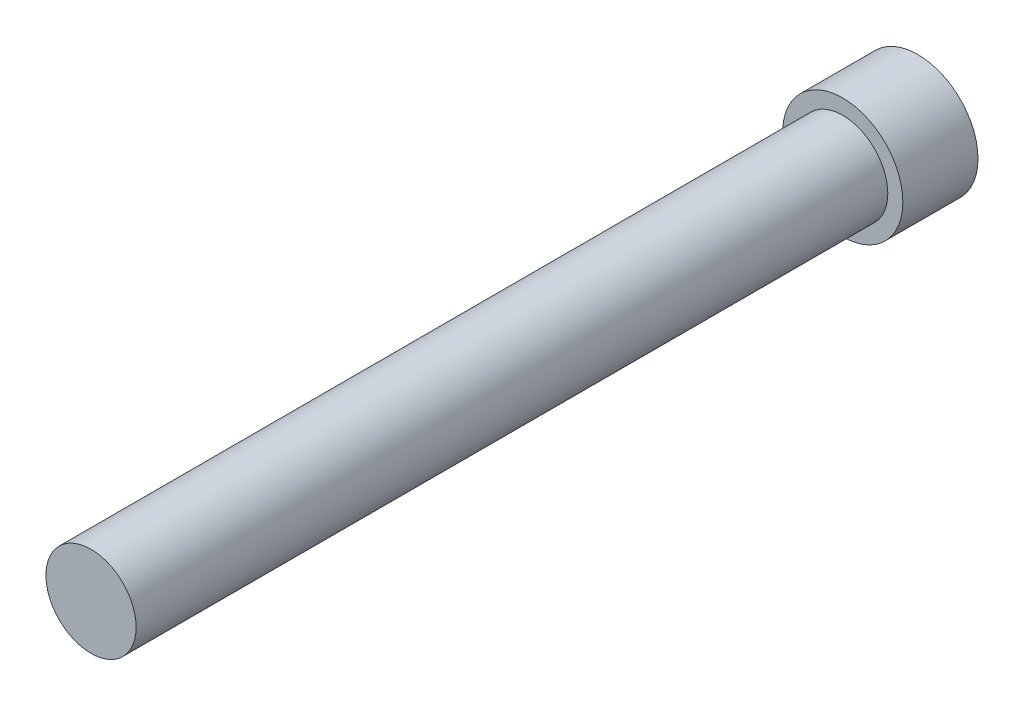
ISO-10303-21;
HEADER;
FILE_DESCRIPTION(('STEP AP214'),'2;1');
FILE_NAME('part.step','',(''),(''),'','','');
FILE_SCHEMA(('AUTOMOTIVE_DESIGN { 1 0 10303 214 1 1 1 1 }'));
ENDSEC;
DATA;
#1=APPLICATION_CONTEXT('core data for automotive mechanical design processes');
#2=APPLICATION_PROTOCOL_DEFINITION('international standard','automotive_design',2000,#1);
#3=PRODUCT_CONTEXT('',#1,'mechanical');
#4=PRODUCT('Part','Part','',(#3));
#5=PRODUCT_RELATED_PRODUCT_CATEGORY('part','',(#4));
#6=PRODUCT_DEFINITION_FORMATION('','',#4);
#7=PRODUCT_DEFINITION_CONTEXT('part definition',#1,'design');
#8=PRODUCT_DEFINITION('design','',#6,#7);
#9=PRODUCT_DEFINITION_SHAPE('','',#8);
#10=(LENGTH_UNIT() NAMED_UNIT(*) SI_UNIT(.MILLI.,.METRE.));
#11=(NAMED_UNIT(*) PLANE_ANGLE_UNIT() SI_UNIT($,.RADIAN.));
#12=(NAMED_UNIT(*) SI_UNIT($,.STERADIAN.) SOLID_ANGLE_UNIT());
#13=UNCERTAINTY_MEASURE_WITH_UNIT(LENGTH_MEASURE(1.E-05),#10,'distance_accuracy_value','');
#14=(GEOMETRIC_REPRESENTATION_CONTEXT(3) GLOBAL_UNCERTAINTY_ASSIGNED_CONTEXT((#13)) GLOBAL_UNIT_ASSIGNED_CONTEXT((#10,
#11,#12)) REPRESENTATION_CONTEXT('',''));
#15=CARTESIAN_POINT('',(0.,0.,0.));
#16=DIRECTION('',(0.,0.,1.));
#17=DIRECTION('',(1.,0.,0.));
#18=AXIS2_PLACEMENT_3D('',#15,#16,#17);
#19=CARTESIAN_POINT('',(0.,0.,2.5));
#20=DIRECTION('',(0.,0.,1.));
#21=DIRECTION('',(1.,0.,0.));
#22=AXIS2_PLACEMENT_3D('',#19,#20,#21);
#23=PLANE('',#22);
#24=CARTESIAN_POINT('',(0.,0.,2.5));
#25=DIRECTION('',(0.,0.,1.));
#26=DIRECTION('',(1.,0.,0.));
#27=AXIS2_PLACEMENT_3D('',#24,#25,#26);
#28=CIRCLE('',#27,1.5);
#29=CARTESIAN_POINT('',(1.5,0.,2.5));
#30=VERTEX_POINT('',#29);
#31=EDGE_CURVE('E173',#30,#30,#28,.T.);
#32=ORIENTED_EDGE('',*,*,#31,.F.);
#33=EDGE_LOOP('',(#32));
#34=FACE_BOUND('',#33,.T.);
#35=CARTESIAN_POINT('',(0.,0.,2.5));
#36=DIRECTION('',(0.,0.,1.));
#37=DIRECTION('',(1.,0.,0.));
#38=AXIS2_PLACEMENT_3D('',#35,#36,#37);
#39=CIRCLE('',#38,2.);
#40=CARTESIAN_POINT('',(2.,0.,2.5));
#41=VERTEX_POINT('',#40);
#42=EDGE_CURVE('E11',#41,#41,#39,.T.);
#43=ORIENTED_EDGE('',*,*,#42,.T.);
#44=EDGE_LOOP('',(#43));
#45=FACE_BOUND('',#44,.T.);
#46=ADVANCED_FACE('F37',(#34,#45),#23,.T.);
#47=CARTESIAN_POINT('',(0.,0.,0.));
#48=DIRECTION('',(0.,0.,1.));
#49=DIRECTION('',(1.,0.,0.));
#50=AXIS2_PLACEMENT_3D('',#47,#48,#49);
#51=PLANE('',#50);
#52=CARTESIAN_POINT('',(0.,0.,0.));
#53=DIRECTION('',(0.,0.,1.));
#54=DIRECTION('',(1.,0.,0.));
#55=AXIS2_PLACEMENT_3D('',#52,#53,#54);
#56=CIRCLE('',#55,2.);
#57=CARTESIAN_POINT('',(2.,0.,0.));
#58=VERTEX_POINT('',#57);
#59=EDGE_CURVE('E41',#58,#58,#56,.T.);
#60=ORIENTED_EDGE('',*,*,#59,.F.);
#61=EDGE_LOOP('',(#60));
#62=FACE_BOUND('',#61,.T.);
#63=DIRECTION('',(-0.979936991565401,-0.199307532626719,0.));
#64=VECTOR('',#63,1.);
#65=CARTESIAN_POINT('',(0.458074191553048,1.3687590614737,0.));
#66=LINE('',#65,#64);
#67=CARTESIAN_POINT('',(0.458074191553048,1.3687590614737,0.));
#68=VERTEX_POINT('',#67);
#69=CARTESIAN_POINT('',(-0.956343023119844,1.08108341743981,0.));
#70=VERTEX_POINT('',#69);
#71=EDGE_CURVE('E52',#68,#70,#66,.T.);
#72=ORIENTED_EDGE('',*,*,#71,.T.);
#73=DIRECTION('',(-0.317363109362366,-0.948304095117094,0.));
#74=VECTOR('',#73,1.);
#75=CARTESIAN_POINT('',(-0.956343023119844,1.08108341743981,0.));
#76=LINE('',#75,#74);
#77=CARTESIAN_POINT('',(-1.41441721467289,-0.28767564403389,0.));
#78=VERTEX_POINT('',#77);
#79=EDGE_CURVE('E112',#70,#78,#76,.T.);
#80=ORIENTED_EDGE('',*,*,#79,.T.);
#81=DIRECTION('',(0.662573882203035,-0.748996562490375,0.));
#82=VECTOR('',#81,1.);
#83=CARTESIAN_POINT('',(-1.41441721467289,-0.28767564403389,0.));
#84=LINE('',#83,#82);
#85=CARTESIAN_POINT('',(-0.458074191553046,-1.3687590614737,0.));
#86=VERTEX_POINT('',#85);
#87=EDGE_CURVE('E110',#78,#86,#84,.T.);
#88=ORIENTED_EDGE('',*,*,#87,.T.);
#89=DIRECTION('',(0.979936991565401,0.199307532626719,0.));
#90=VECTOR('',#89,1.);
#91=CARTESIAN_POINT('',(-0.458074191553046,-1.3687590614737,0.));
#92=LINE('',#91,#90);
#93=CARTESIAN_POINT('',(0.956343023119844,-1.08108341743981,0.));
#94=VERTEX_POINT('',#93);
#95=EDGE_CURVE('E88',#86,#94,#92,.T.);
#96=ORIENTED_EDGE('',*,*,#95,.T.);
#97=DIRECTION('',(0.317363109362366,0.948304095117094,0.));
#98=VECTOR('',#97,1.);
#99=CARTESIAN_POINT('',(0.956343023119844,-1.08108341743981,0.));
#100=LINE('',#99,#98);
#101=CARTESIAN_POINT('',(1.41441721467289,0.28767564403389,0.));
#102=VERTEX_POINT('',#101);
#103=EDGE_CURVE('E99',#94,#102,#100,.T.);
#104=ORIENTED_EDGE('',*,*,#103,.T.);
#105=DIRECTION('',(-0.662573882203035,0.748996562490376,0.));
#106=VECTOR('',#105,1.);
#107=CARTESIAN_POINT('',(1.41441721467289,0.28767564403389,0.));
#108=LINE('',#107,#106);
#109=EDGE_CURVE('E105',#102,#68,#108,.T.);
#110=ORIENTED_EDGE('',*,*,#109,.T.);
#111=EDGE_LOOP('',(#72,#80,#88,#96,#104,#110));
#112=FACE_BOUND('',#111,.T.);
#113=ADVANCED_FACE('F107',(#62,#112),#51,.F.);
#114=CARTESIAN_POINT('',(0.,0.,2.5));
#115=DIRECTION('',(0.,0.,-1.));
#116=DIRECTION('',(-1.,0.,0.));
#117=AXIS2_PLACEMENT_3D('',#114,#115,#116);
#118=CYLINDRICAL_SURFACE('',#117,2.);
#119=ORIENTED_EDGE('',*,*,#42,.F.);
#120=EDGE_LOOP('',(#119));
#121=FACE_BOUND('',#120,.T.);
#122=ORIENTED_EDGE('',*,*,#59,.T.);
#123=EDGE_LOOP('',(#122));
#124=FACE_BOUND('',#123,.T.);
#125=ADVANCED_FACE('F39',(#121,#124),#118,.T.);
#126=CARTESIAN_POINT('',(0.458074191553048,1.3687590614737,2.5));
#127=DIRECTION('',(0.199307532626719,-0.979936991565401,0.));
#128=DIRECTION('',(0.979936991565401,0.199307532626719,0.));
#129=AXIS2_PLACEMENT_3D('',#126,#127,#128);
#130=PLANE('',#129);
#131=ORIENTED_EDGE('',*,*,#71,.F.);
#132=DIRECTION('',(0.,0.,-1.));
#133=VECTOR('',#132,1.);
#134=CARTESIAN_POINT('',(0.458074191553048,1.3687590614737,2.5));
#135=LINE('',#134,#133);
#136=CARTESIAN_POINT('',(0.458074191553048,1.3687590614737,2.5));
#137=VERTEX_POINT('',#136);
#138=EDGE_CURVE('E117',#137,#68,#135,.T.);
#139=ORIENTED_EDGE('',*,*,#138,.F.);
#140=DIRECTION('',(-0.979936991565401,-0.199307532626719,0.));
#141=VECTOR('',#140,1.);
#142=CARTESIAN_POINT('',(0.458074191553048,1.3687590614737,2.5));
#143=LINE('',#142,#141);
#144=CARTESIAN_POINT('',(-0.956343023119844,1.08108341743981,2.5));
#145=VERTEX_POINT('',#144);
#146=EDGE_CURVE('E61',#137,#145,#143,.T.);
#147=ORIENTED_EDGE('',*,*,#146,.T.);
#148=DIRECTION('',(0.,0.,-1.));
#149=VECTOR('',#148,1.);
#150=CARTESIAN_POINT('',(-0.956343023119844,1.08108341743981,2.5));
#151=LINE('',#150,#149);
#152=EDGE_CURVE('E124',#145,#70,#151,.T.);
#153=ORIENTED_EDGE('',*,*,#152,.T.);
#154=EDGE_LOOP('',(#131,#139,#147,#153));
#155=FACE_BOUND('',#154,.T.);
#156=ADVANCED_FACE('F135',(#155),#130,.T.);
#157=CARTESIAN_POINT('',(-0.956343023119844,1.08108341743981,2.5));
#158=DIRECTION('',(0.948304095117094,-0.317363109362366,0.));
#159=DIRECTION('',(0.317363109362366,0.948304095117094,0.));
#160=AXIS2_PLACEMENT_3D('',#157,#158,#159);
#161=PLANE('',#160);
#162=ORIENTED_EDGE('',*,*,#79,.F.);
#163=ORIENTED_EDGE('',*,*,#152,.F.);
#164=DIRECTION('',(-0.317363109362366,-0.948304095117094,0.));
#165=VECTOR('',#164,1.);
#166=CARTESIAN_POINT('',(-0.956343023119844,1.08108341743981,2.5));
#167=LINE('',#166,#165);
#168=CARTESIAN_POINT('',(-1.41441721467289,-0.28767564403389,2.5));
#169=VERTEX_POINT('',#168);
#170=EDGE_CURVE('E180',#145,#169,#167,.T.);
#171=ORIENTED_EDGE('',*,*,#170,.T.);
#172=DIRECTION('',(0.,0.,-1.));
#173=VECTOR('',#172,1.);
#174=CARTESIAN_POINT('',(-1.41441721467289,-0.28767564403389,2.5));
#175=LINE('',#174,#173);
#176=EDGE_CURVE('E122',#169,#78,#175,.T.);
#177=ORIENTED_EDGE('',*,*,#176,.T.);
#178=EDGE_LOOP('',(#162,#163,#171,#177));
#179=FACE_BOUND('',#178,.T.);
#180=ADVANCED_FACE('F142',(#179),#161,.T.);
#181=CARTESIAN_POINT('',(-1.41441721467289,-0.28767564403389,2.5));
#182=DIRECTION('',(0.748996562490375,0.662573882203035,0.));
#183=DIRECTION('',(-0.662573882203035,0.748996562490375,0.));
#184=AXIS2_PLACEMENT_3D('',#181,#182,#183);
#185=PLANE('',#184);
#186=ORIENTED_EDGE('',*,*,#87,.F.);
#187=ORIENTED_EDGE('',*,*,#176,.F.);
#188=DIRECTION('',(0.662573882203035,-0.748996562490375,0.));
#189=VECTOR('',#188,1.);
#190=CARTESIAN_POINT('',(-1.41441721467289,-0.28767564403389,2.5));
#191=LINE('',#190,#189);
#192=CARTESIAN_POINT('',(-0.458074191553046,-1.3687590614737,2.5));
#193=VERTEX_POINT('',#192);
#194=EDGE_CURVE('E183',#169,#193,#191,.T.);
#195=ORIENTED_EDGE('',*,*,#194,.T.);
#196=DIRECTION('',(0.,0.,-1.));
#197=VECTOR('',#196,1.);
#198=CARTESIAN_POINT('',(-0.458074191553046,-1.3687590614737,2.5));
#199=LINE('',#198,#197);
#200=EDGE_CURVE('E95',#193,#86,#199,.T.);
#201=ORIENTED_EDGE('',*,*,#200,.T.);
#202=EDGE_LOOP('',(#186,#187,#195,#201));
#203=FACE_BOUND('',#202,.T.);
#204=ADVANCED_FACE('F145',(#203),#185,.T.);
#205=CARTESIAN_POINT('',(-0.458074191553046,-1.3687590614737,2.5));
#206=DIRECTION('',(-0.199307532626719,0.979936991565401,0.));
#207=DIRECTION('',(-0.979936991565401,-0.199307532626719,0.));
#208=AXIS2_PLACEMENT_3D('',#205,#206,#207);
#209=PLANE('',#208);
#210=ORIENTED_EDGE('',*,*,#95,.F.);
#211=ORIENTED_EDGE('',*,*,#200,.F.);
#212=DIRECTION('',(0.979936991565401,0.199307532626719,0.));
#213=VECTOR('',#212,1.);
#214=CARTESIAN_POINT('',(-0.458074191553046,-1.3687590614737,2.5));
#215=LINE('',#214,#213);
#216=CARTESIAN_POINT('',(0.956343023119844,-1.08108341743981,2.5));
#217=VERTEX_POINT('',#216);
#218=EDGE_CURVE('E92',#193,#217,#215,.T.);
#219=ORIENTED_EDGE('',*,*,#218,.T.);
#220=DIRECTION('',(0.,0.,-1.));
#221=VECTOR('',#220,1.);
#222=CARTESIAN_POINT('',(0.956343023119844,-1.08108341743981,2.5));
#223=LINE('',#222,#221);
#224=EDGE_CURVE('E83',#217,#94,#223,.T.);
#225=ORIENTED_EDGE('',*,*,#224,.T.);
#226=EDGE_LOOP('',(#210,#211,#219,#225));
#227=FACE_BOUND('',#226,.T.);
#228=ADVANCED_FACE('F85',(#227),#209,.T.);
#229=CARTESIAN_POINT('',(0.956343023119844,-1.08108341743981,2.5));
#230=DIRECTION('',(-0.948304095117094,0.317363109362366,0.));
#231=DIRECTION('',(-0.317363109362366,-0.948304095117094,0.));
#232=AXIS2_PLACEMENT_3D('',#229,#230,#231);
#233=PLANE('',#232);
#234=ORIENTED_EDGE('',*,*,#103,.F.);
#235=ORIENTED_EDGE('',*,*,#224,.F.);
#236=DIRECTION('',(0.317363109362366,0.948304095117094,0.));
#237=VECTOR('',#236,1.);
#238=CARTESIAN_POINT('',(0.956343023119844,-1.08108341743981,2.5));
#239=LINE('',#238,#237);
#240=CARTESIAN_POINT('',(1.41441721467289,0.28767564403389,2.5));
#241=VERTEX_POINT('',#240);
#242=EDGE_CURVE('E187',#217,#241,#239,.T.);
#243=ORIENTED_EDGE('',*,*,#242,.T.);
#244=DIRECTION('',(0.,0.,-1.));
#245=VECTOR('',#244,1.);
#246=CARTESIAN_POINT('',(1.41441721467289,0.28767564403389,2.5));
#247=LINE('',#246,#245);
#248=EDGE_CURVE('E96',#241,#102,#247,.T.);
#249=ORIENTED_EDGE('',*,*,#248,.T.);
#250=EDGE_LOOP('',(#234,#235,#243,#249));
#251=FACE_BOUND('',#250,.T.);
#252=ADVANCED_FACE('F100',(#251),#233,.T.);
#253=CARTESIAN_POINT('',(1.41441721467289,0.28767564403389,2.5));
#254=DIRECTION('',(-0.748996562490376,-0.662573882203035,0.));
#255=DIRECTION('',(0.662573882203035,-0.748996562490376,0.));
#256=AXIS2_PLACEMENT_3D('',#253,#254,#255);
#257=PLANE('',#256);
#258=ORIENTED_EDGE('',*,*,#109,.F.);
#259=ORIENTED_EDGE('',*,*,#248,.F.);
#260=DIRECTION('',(-0.662573882203035,0.748996562490376,0.));
#261=VECTOR('',#260,1.);
#262=CARTESIAN_POINT('',(1.41441721467289,0.28767564403389,2.5));
#263=LINE('',#262,#261);
#264=EDGE_CURVE('E119',#241,#137,#263,.T.);
#265=ORIENTED_EDGE('',*,*,#264,.T.);
#266=ORIENTED_EDGE('',*,*,#138,.T.);
#267=EDGE_LOOP('',(#258,#259,#265,#266));
#268=FACE_BOUND('',#267,.T.);
#269=ADVANCED_FACE('F154',(#268),#257,.T.);
#270=CARTESIAN_POINT('',(0.,0.,2.5));
#271=DIRECTION('',(0.,0.,1.));
#272=DIRECTION('',(1.,0.,0.));
#273=AXIS2_PLACEMENT_3D('',#270,#271,#272);
#274=PLANE('',#273);
#275=ORIENTED_EDGE('',*,*,#146,.F.);
#276=ORIENTED_EDGE('',*,*,#264,.F.);
#277=ORIENTED_EDGE('',*,*,#242,.F.);
#278=ORIENTED_EDGE('',*,*,#218,.F.);
#279=ORIENTED_EDGE('',*,*,#194,.F.);
#280=ORIENTED_EDGE('',*,*,#170,.F.);
#281=EDGE_LOOP('',(#275,#276,#277,#278,#279,#280));
#282=FACE_BOUND('',#281,.T.);
#283=ADVANCED_FACE('F157',(#282),#274,.F.);
#284=CARTESIAN_POINT('',(0.,0.,27.5));
#285=DIRECTION('',(0.,0.,-1.));
#286=DIRECTION('',(-1.,0.,0.));
#287=AXIS2_PLACEMENT_3D('',#284,#285,#286);
#288=CYLINDRICAL_SURFACE('',#287,1.5);
#289=CARTESIAN_POINT('',(0.,0.,27.5));
#290=DIRECTION('',(0.,0.,1.));
#291=DIRECTION('',(1.,0.,0.));
#292=AXIS2_PLACEMENT_3D('',#289,#290,#291);
#293=CIRCLE('',#292,1.5);
#294=CARTESIAN_POINT('',(1.5,0.,27.5));
#295=VERTEX_POINT('',#294);
#296=EDGE_CURVE('E172',#295,#295,#293,.T.);
#297=ORIENTED_EDGE('',*,*,#296,.F.);
#298=EDGE_LOOP('',(#297));
#299=FACE_BOUND('',#298,.T.);
#300=ORIENTED_EDGE('',*,*,#31,.T.);
#301=EDGE_LOOP('',(#300));
#302=FACE_BOUND('',#301,.T.);
#303=ADVANCED_FACE('F159',(#299,#302),#288,.T.);
#304=CARTESIAN_POINT('',(0.,0.,27.5));
#305=DIRECTION('',(0.,0.,1.));
#306=DIRECTION('',(1.,0.,0.));
#307=AXIS2_PLACEMENT_3D('',#304,#305,#306);
#308=PLANE('',#307);
#309=ORIENTED_EDGE('',*,*,#296,.T.);
#310=EDGE_LOOP('',(#309));
#311=FACE_BOUND('',#310,.T.);
#312=ADVANCED_FACE('F162',(#311),#308,.T.);
#313=CLOSED_SHELL('',(#46,#113,#125,#156,#180,#204,#228,#252,#269,#283,#303,#312));
#314=MANIFOLD_SOLID_BREP('B2',#313);
#315=ADVANCED_BREP_SHAPE_REPRESENTATION('',(#18,#314),#14);
#316=SHAPE_DEFINITION_REPRESENTATION(#9,#315);
ENDSEC;
END-ISO-10303-21;
